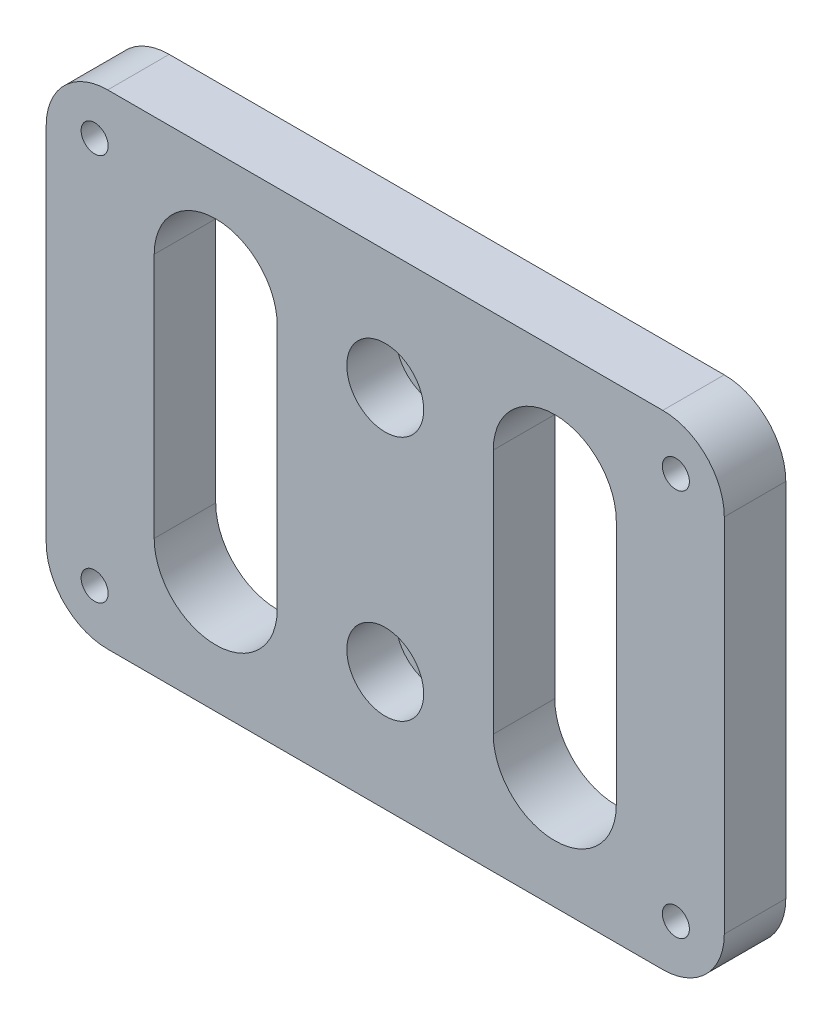
ISO-10303-21;
HEADER;
FILE_DESCRIPTION(('STEP AP214'),'2;1');
FILE_NAME('part.step','',(''),(''),'','','');
FILE_SCHEMA(('AUTOMOTIVE_DESIGN { 1 0 10303 214 1 1 1 1 }'));
ENDSEC;
DATA;
#1=APPLICATION_CONTEXT('core data for automotive mechanical design processes');
#2=APPLICATION_PROTOCOL_DEFINITION('international standard','automotive_design',2000,#1);
#3=PRODUCT_CONTEXT('',#1,'mechanical');
#4=PRODUCT('Part','Part','',(#3));
#5=PRODUCT_RELATED_PRODUCT_CATEGORY('part','',(#4));
#6=PRODUCT_DEFINITION_FORMATION('','',#4);
#7=PRODUCT_DEFINITION_CONTEXT('part definition',#1,'design');
#8=PRODUCT_DEFINITION('design','',#6,#7);
#9=PRODUCT_DEFINITION_SHAPE('','',#8);
#10=(LENGTH_UNIT() NAMED_UNIT(*) SI_UNIT(.MILLI.,.METRE.));
#11=(NAMED_UNIT(*) PLANE_ANGLE_UNIT() SI_UNIT($,.RADIAN.));
#12=(NAMED_UNIT(*) SI_UNIT($,.STERADIAN.) SOLID_ANGLE_UNIT());
#13=UNCERTAINTY_MEASURE_WITH_UNIT(LENGTH_MEASURE(1.E-05),#10,'distance_accuracy_value','');
#14=(GEOMETRIC_REPRESENTATION_CONTEXT(3) GLOBAL_UNCERTAINTY_ASSIGNED_CONTEXT((#13)) GLOBAL_UNIT_ASSIGNED_CONTEXT((#10,
#11,#12)) REPRESENTATION_CONTEXT('',''));
#15=CARTESIAN_POINT('',(0.,0.,0.));
#16=DIRECTION('',(0.,0.,1.));
#17=DIRECTION('',(1.,0.,0.));
#18=AXIS2_PLACEMENT_3D('',#15,#16,#17);
#19=CARTESIAN_POINT('',(0.,12.7,6.35));
#20=DIRECTION('',(0.,0.,-1.));
#21=DIRECTION('',(-1.,0.,0.));
#22=AXIS2_PLACEMENT_3D('',#19,#20,#21);
#23=CYLINDRICAL_SURFACE('',#22,2.4892);
#24=CARTESIAN_POINT('',(0.,12.7,0.));
#25=DIRECTION('',(0.,0.,1.));
#26=DIRECTION('',(1.,0.,0.));
#27=AXIS2_PLACEMENT_3D('',#24,#25,#26);
#28=CIRCLE('',#27,2.4892);
#29=CARTESIAN_POINT('',(2.4892,12.7,0.));
#30=VERTEX_POINT('',#29);
#31=EDGE_CURVE('E226',#30,#30,#28,.T.);
#32=ORIENTED_EDGE('',*,*,#31,.F.);
#33=EDGE_LOOP('',(#32));
#34=FACE_BOUND('',#33,.T.);
#35=CARTESIAN_POINT('',(0.,12.7,1.27));
#36=DIRECTION('',(0.,0.,1.));
#37=DIRECTION('',(1.,0.,0.));
#38=AXIS2_PLACEMENT_3D('',#35,#36,#37);
#39=CIRCLE('',#38,2.4892);
#40=CARTESIAN_POINT('',(2.4892,12.7,1.27));
#41=VERTEX_POINT('',#40);
#42=EDGE_CURVE('E37',#41,#41,#39,.T.);
#43=ORIENTED_EDGE('',*,*,#42,.T.);
#44=EDGE_LOOP('',(#43));
#45=FACE_BOUND('',#44,.T.);
#46=ADVANCED_FACE('F33',(#34,#45),#23,.F.);
#47=CARTESIAN_POINT('',(0.,-12.7,6.35));
#48=DIRECTION('',(0.,0.,-1.));
#49=DIRECTION('',(-1.,0.,0.));
#50=AXIS2_PLACEMENT_3D('',#47,#48,#49);
#51=CYLINDRICAL_SURFACE('',#50,2.4892);
#52=CARTESIAN_POINT('',(0.,-12.7,0.));
#53=DIRECTION('',(0.,0.,1.));
#54=DIRECTION('',(1.,0.,0.));
#55=AXIS2_PLACEMENT_3D('',#52,#53,#54);
#56=CIRCLE('',#55,2.4892);
#57=CARTESIAN_POINT('',(2.4892,-12.7,0.));
#58=VERTEX_POINT('',#57);
#59=EDGE_CURVE('E223',#58,#58,#56,.T.);
#60=ORIENTED_EDGE('',*,*,#59,.F.);
#61=EDGE_LOOP('',(#60));
#62=FACE_BOUND('',#61,.T.);
#63=CARTESIAN_POINT('',(0.,-12.7,1.27));
#64=DIRECTION('',(0.,0.,1.));
#65=DIRECTION('',(1.,0.,0.));
#66=AXIS2_PLACEMENT_3D('',#63,#64,#65);
#67=CIRCLE('',#66,2.4892);
#68=CARTESIAN_POINT('',(2.4892,-12.7,1.27));
#69=VERTEX_POINT('',#68);
#70=EDGE_CURVE('E304',#69,#69,#67,.T.);
#71=ORIENTED_EDGE('',*,*,#70,.T.);
#72=EDGE_LOOP('',(#71));
#73=FACE_BOUND('',#72,.T.);
#74=ADVANCED_FACE('F329',(#62,#73),#51,.F.);
#75=CARTESIAN_POINT('',(0.,0.,6.35));
#76=DIRECTION('',(0.,0.,-1.));
#77=DIRECTION('',(-1.,0.,0.));
#78=AXIS2_PLACEMENT_3D('',#75,#76,#77);
#79=PLANE('',#78);
#80=CARTESIAN_POINT('',(0.,12.7,6.35));
#81=DIRECTION('',(0.,0.,1.));
#82=DIRECTION('',(1.,0.,0.));
#83=AXIS2_PLACEMENT_3D('',#80,#81,#82);
#84=CIRCLE('',#83,3.96875);
#85=CARTESIAN_POINT('',(3.96875,12.7,6.35));
#86=VERTEX_POINT('',#85);
#87=EDGE_CURVE('E311',#86,#86,#84,.T.);
#88=ORIENTED_EDGE('',*,*,#87,.F.);
#89=EDGE_LOOP('',(#88));
#90=FACE_BOUND('',#89,.T.);
#91=CARTESIAN_POINT('',(0.,-12.7,6.35));
#92=DIRECTION('',(0.,0.,1.));
#93=DIRECTION('',(1.,0.,0.));
#94=AXIS2_PLACEMENT_3D('',#91,#92,#93);
#95=CIRCLE('',#94,3.96875);
#96=CARTESIAN_POINT('',(3.96875,-12.7,6.35));
#97=VERTEX_POINT('',#96);
#98=EDGE_CURVE('E320',#97,#97,#95,.T.);
#99=ORIENTED_EDGE('',*,*,#98,.F.);
#100=EDGE_LOOP('',(#99));
#101=FACE_BOUND('',#100,.T.);
#102=CARTESIAN_POINT('',(-17.5,-12.7,6.35));
#103=DIRECTION('',(0.,0.,1.));
#104=DIRECTION('',(1.,0.,0.));
#105=AXIS2_PLACEMENT_3D('',#102,#103,#104);
#106=CIRCLE('',#105,6.35);
#107=CARTESIAN_POINT('',(-23.85,-12.7,6.35));
#108=VERTEX_POINT('',#107);
#109=CARTESIAN_POINT('',(-11.15,-12.7,6.35));
#110=VERTEX_POINT('',#109);
#111=EDGE_CURVE('E193',#108,#110,#106,.T.);
#112=ORIENTED_EDGE('',*,*,#111,.F.);
#113=DIRECTION('',(0.,-1.,0.));
#114=VECTOR('',#113,1.);
#115=CARTESIAN_POINT('',(-23.85,-12.7,6.35));
#116=LINE('',#115,#114);
#117=CARTESIAN_POINT('',(-23.85,12.7,6.35));
#118=VERTEX_POINT('',#117);
#119=EDGE_CURVE('E201',#118,#108,#116,.T.);
#120=ORIENTED_EDGE('',*,*,#119,.F.);
#121=CARTESIAN_POINT('',(-17.5,12.7,6.35));
#122=DIRECTION('',(0.,0.,1.));
#123=DIRECTION('',(1.,0.,0.));
#124=AXIS2_PLACEMENT_3D('',#121,#122,#123);
#125=CIRCLE('',#124,6.35);
#126=CARTESIAN_POINT('',(-11.15,12.7,6.35));
#127=VERTEX_POINT('',#126);
#128=EDGE_CURVE('E198',#127,#118,#125,.T.);
#129=ORIENTED_EDGE('',*,*,#128,.F.);
#130=DIRECTION('',(0.,1.,0.));
#131=VECTOR('',#130,1.);
#132=CARTESIAN_POINT('',(-11.15,-12.7,6.35));
#133=LINE('',#132,#131);
#134=EDGE_CURVE('E195',#110,#127,#133,.T.);
#135=ORIENTED_EDGE('',*,*,#134,.F.);
#136=EDGE_LOOP('',(#112,#120,#129,#135));
#137=FACE_BOUND('',#136,.T.);
#138=DIRECTION('',(-1.,0.,0.));
#139=VECTOR('',#138,1.);
#140=CARTESIAN_POINT('',(-35.,25.,6.35));
#141=LINE('',#140,#139);
#142=CARTESIAN_POINT('',(28.65,25.,6.35));
#143=VERTEX_POINT('',#142);
#144=CARTESIAN_POINT('',(-28.65,25.,6.35));
#145=VERTEX_POINT('',#144);
#146=EDGE_CURVE('E262',#143,#145,#141,.T.);
#147=ORIENTED_EDGE('',*,*,#146,.T.);
#148=CARTESIAN_POINT('',(-28.65,18.65,6.35));
#149=DIRECTION('',(0.,0.,-1.));
#150=DIRECTION('',(-1.,0.,0.));
#151=AXIS2_PLACEMENT_3D('',#148,#149,#150);
#152=CIRCLE('',#151,6.35);
#153=CARTESIAN_POINT('',(-35.,18.65,6.35));
#154=VERTEX_POINT('',#153);
#155=EDGE_CURVE('E297',#145,#154,#152,.F.);
#156=ORIENTED_EDGE('',*,*,#155,.T.);
#157=DIRECTION('',(0.,-1.,0.));
#158=VECTOR('',#157,1.);
#159=CARTESIAN_POINT('',(-35.,-25.,6.35));
#160=LINE('',#159,#158);
#161=CARTESIAN_POINT('',(-35.,-18.65,6.35));
#162=VERTEX_POINT('',#161);
#163=EDGE_CURVE('E254',#154,#162,#160,.T.);
#164=ORIENTED_EDGE('',*,*,#163,.T.);
#165=CARTESIAN_POINT('',(-28.65,-18.65,6.35));
#166=DIRECTION('',(0.,0.,-1.));
#167=DIRECTION('',(-1.,0.,0.));
#168=AXIS2_PLACEMENT_3D('',#165,#166,#167);
#169=CIRCLE('',#168,6.35);
#170=CARTESIAN_POINT('',(-28.65,-25.,6.35));
#171=VERTEX_POINT('',#170);
#172=EDGE_CURVE('E295',#162,#171,#169,.F.);
#173=ORIENTED_EDGE('',*,*,#172,.T.);
#174=DIRECTION('',(1.,0.,0.));
#175=VECTOR('',#174,1.);
#176=CARTESIAN_POINT('',(-35.,-25.,6.35));
#177=LINE('',#176,#175);
#178=CARTESIAN_POINT('',(28.65,-25.,6.35));
#179=VERTEX_POINT('',#178);
#180=EDGE_CURVE('E257',#171,#179,#177,.T.);
#181=ORIENTED_EDGE('',*,*,#180,.T.);
#182=CARTESIAN_POINT('',(28.65,-18.65,6.35));
#183=DIRECTION('',(0.,0.,-1.));
#184=DIRECTION('',(-1.,0.,0.));
#185=AXIS2_PLACEMENT_3D('',#182,#183,#184);
#186=CIRCLE('',#185,6.35);
#187=CARTESIAN_POINT('',(35.,-18.65,6.35));
#188=VERTEX_POINT('',#187);
#189=EDGE_CURVE('E56',#179,#188,#186,.F.);
#190=ORIENTED_EDGE('',*,*,#189,.T.);
#191=DIRECTION('',(0.,1.,0.));
#192=VECTOR('',#191,1.);
#193=CARTESIAN_POINT('',(35.,-25.,6.35));
#194=LINE('',#193,#192);
#195=CARTESIAN_POINT('',(35.,18.65,6.35));
#196=VERTEX_POINT('',#195);
#197=EDGE_CURVE('E260',#188,#196,#194,.T.);
#198=ORIENTED_EDGE('',*,*,#197,.T.);
#199=CARTESIAN_POINT('',(28.65,18.65,6.35));
#200=DIRECTION('',(0.,0.,-1.));
#201=DIRECTION('',(-1.,0.,0.));
#202=AXIS2_PLACEMENT_3D('',#199,#200,#201);
#203=CIRCLE('',#202,6.35);
#204=EDGE_CURVE('E292',#196,#143,#203,.F.);
#205=ORIENTED_EDGE('',*,*,#204,.T.);
#206=EDGE_LOOP('',(#147,#156,#164,#173,#181,#190,#198,#205));
#207=FACE_BOUND('',#206,.T.);
#208=CARTESIAN_POINT('',(30.,20.,6.35));
#209=DIRECTION('',(0.,0.,1.));
#210=DIRECTION('',(1.,0.,0.));
#211=AXIS2_PLACEMENT_3D('',#208,#209,#210);
#212=CIRCLE('',#211,1.39700000000001);
#213=CARTESIAN_POINT('',(31.397,20.,6.35));
#214=VERTEX_POINT('',#213);
#215=EDGE_CURVE('E248',#214,#214,#212,.T.);
#216=ORIENTED_EDGE('',*,*,#215,.F.);
#217=EDGE_LOOP('',(#216));
#218=FACE_BOUND('',#217,.T.);
#219=CARTESIAN_POINT('',(30.,-20.,6.35));
#220=DIRECTION('',(0.,0.,1.));
#221=DIRECTION('',(1.,0.,0.));
#222=AXIS2_PLACEMENT_3D('',#219,#220,#221);
#223=CIRCLE('',#222,1.39700000000001);
#224=CARTESIAN_POINT('',(31.397,-20.,6.35));
#225=VERTEX_POINT('',#224);
#226=EDGE_CURVE('E242',#225,#225,#223,.T.);
#227=ORIENTED_EDGE('',*,*,#226,.F.);
#228=EDGE_LOOP('',(#227));
#229=FACE_BOUND('',#228,.T.);
#230=CARTESIAN_POINT('',(-30.,-20.,6.35));
#231=DIRECTION('',(0.,0.,1.));
#232=DIRECTION('',(1.,0.,0.));
#233=AXIS2_PLACEMENT_3D('',#230,#231,#232);
#234=CIRCLE('',#233,1.397);
#235=CARTESIAN_POINT('',(-28.603,-20.,6.35));
#236=VERTEX_POINT('',#235);
#237=EDGE_CURVE('E236',#236,#236,#234,.T.);
#238=ORIENTED_EDGE('',*,*,#237,.F.);
#239=EDGE_LOOP('',(#238));
#240=FACE_BOUND('',#239,.T.);
#241=CARTESIAN_POINT('',(-30.,20.,6.35));
#242=DIRECTION('',(0.,0.,1.));
#243=DIRECTION('',(1.,0.,0.));
#244=AXIS2_PLACEMENT_3D('',#241,#242,#243);
#245=CIRCLE('',#244,1.397);
#246=CARTESIAN_POINT('',(-28.603,20.,6.35));
#247=VERTEX_POINT('',#246);
#248=EDGE_CURVE('E230',#247,#247,#245,.T.);
#249=ORIENTED_EDGE('',*,*,#248,.F.);
#250=EDGE_LOOP('',(#249));
#251=FACE_BOUND('',#250,.T.);
#252=CARTESIAN_POINT('',(17.5,12.7,6.35));
#253=DIRECTION('',(0.,0.,1.));
#254=DIRECTION('',(1.,0.,0.));
#255=AXIS2_PLACEMENT_3D('',#252,#253,#254);
#256=CIRCLE('',#255,6.35);
#257=CARTESIAN_POINT('',(23.85,12.7,6.35));
#258=VERTEX_POINT('',#257);
#259=CARTESIAN_POINT('',(11.15,12.7,6.35));
#260=VERTEX_POINT('',#259);
#261=EDGE_CURVE('E150',#258,#260,#256,.T.);
#262=ORIENTED_EDGE('',*,*,#261,.F.);
#263=DIRECTION('',(0.,1.,0.));
#264=VECTOR('',#263,1.);
#265=CARTESIAN_POINT('',(23.85,12.7,6.35));
#266=LINE('',#265,#264);
#267=CARTESIAN_POINT('',(23.85,-12.7,6.35));
#268=VERTEX_POINT('',#267);
#269=EDGE_CURVE('E176',#268,#258,#266,.T.);
#270=ORIENTED_EDGE('',*,*,#269,.F.);
#271=CARTESIAN_POINT('',(17.5,-12.7,6.35));
#272=DIRECTION('',(0.,0.,1.));
#273=DIRECTION('',(1.,0.,0.));
#274=AXIS2_PLACEMENT_3D('',#271,#272,#273);
#275=CIRCLE('',#274,6.35);
#276=CARTESIAN_POINT('',(11.15,-12.7,6.35));
#277=VERTEX_POINT('',#276);
#278=EDGE_CURVE('E174',#277,#268,#275,.T.);
#279=ORIENTED_EDGE('',*,*,#278,.F.);
#280=DIRECTION('',(0.,-1.,0.));
#281=VECTOR('',#280,1.);
#282=CARTESIAN_POINT('',(11.15,12.7,6.35));
#283=LINE('',#282,#281);
#284=EDGE_CURVE('E160',#260,#277,#283,.T.);
#285=ORIENTED_EDGE('',*,*,#284,.F.);
#286=EDGE_LOOP('',(#262,#270,#279,#285));
#287=FACE_BOUND('',#286,.T.);
#288=ADVANCED_FACE('F172',(#90,#101,#137,#207,#218,#229,#240,#251,#287),#79,.F.);
#289=CARTESIAN_POINT('',(0.,0.,0.));
#290=DIRECTION('',(0.,0.,-1.));
#291=DIRECTION('',(-1.,0.,0.));
#292=AXIS2_PLACEMENT_3D('',#289,#290,#291);
#293=PLANE('',#292);
#294=ORIENTED_EDGE('',*,*,#31,.T.);
#295=EDGE_LOOP('',(#294));
#296=FACE_BOUND('',#295,.T.);
#297=CARTESIAN_POINT('',(-30.,-20.,0.));
#298=DIRECTION('',(0.,0.,1.));
#299=DIRECTION('',(1.,0.,0.));
#300=AXIS2_PLACEMENT_3D('',#297,#298,#299);
#301=CIRCLE('',#300,1.397);
#302=CARTESIAN_POINT('',(-28.603,-20.,0.));
#303=VERTEX_POINT('',#302);
#304=EDGE_CURVE('E233',#303,#303,#301,.T.);
#305=ORIENTED_EDGE('',*,*,#304,.T.);
#306=EDGE_LOOP('',(#305));
#307=FACE_BOUND('',#306,.T.);
#308=CARTESIAN_POINT('',(30.,20.,0.));
#309=DIRECTION('',(0.,0.,1.));
#310=DIRECTION('',(1.,0.,0.));
#311=AXIS2_PLACEMENT_3D('',#308,#309,#310);
#312=CIRCLE('',#311,1.39700000000001);
#313=CARTESIAN_POINT('',(31.397,20.,0.));
#314=VERTEX_POINT('',#313);
#315=EDGE_CURVE('E245',#314,#314,#312,.T.);
#316=ORIENTED_EDGE('',*,*,#315,.T.);
#317=EDGE_LOOP('',(#316));
#318=FACE_BOUND('',#317,.T.);
#319=DIRECTION('',(0.,-1.,0.));
#320=VECTOR('',#319,1.);
#321=CARTESIAN_POINT('',(-35.,-25.,0.));
#322=LINE('',#321,#320);
#323=CARTESIAN_POINT('',(-35.,18.65,0.));
#324=VERTEX_POINT('',#323);
#325=CARTESIAN_POINT('',(-35.,-18.65,0.));
#326=VERTEX_POINT('',#325);
#327=EDGE_CURVE('E251',#324,#326,#322,.T.);
#328=ORIENTED_EDGE('',*,*,#327,.F.);
#329=CARTESIAN_POINT('',(-28.65,18.65,0.));
#330=DIRECTION('',(0.,0.,-1.));
#331=DIRECTION('',(-1.,0.,0.));
#332=AXIS2_PLACEMENT_3D('',#329,#330,#331);
#333=CIRCLE('',#332,6.35);
#334=CARTESIAN_POINT('',(-28.65,25.,0.));
#335=VERTEX_POINT('',#334);
#336=EDGE_CURVE('E285',#324,#335,#333,.T.);
#337=ORIENTED_EDGE('',*,*,#336,.T.);
#338=DIRECTION('',(-1.,0.,0.));
#339=VECTOR('',#338,1.);
#340=CARTESIAN_POINT('',(-35.,25.,0.));
#341=LINE('',#340,#339);
#342=CARTESIAN_POINT('',(28.65,25.,0.));
#343=VERTEX_POINT('',#342);
#344=EDGE_CURVE('E258',#343,#335,#341,.T.);
#345=ORIENTED_EDGE('',*,*,#344,.F.);
#346=CARTESIAN_POINT('',(28.65,18.65,0.));
#347=DIRECTION('',(0.,0.,-1.));
#348=DIRECTION('',(-1.,0.,0.));
#349=AXIS2_PLACEMENT_3D('',#346,#347,#348);
#350=CIRCLE('',#349,6.35);
#351=CARTESIAN_POINT('',(35.,18.65,0.));
#352=VERTEX_POINT('',#351);
#353=EDGE_CURVE('E279',#343,#352,#350,.T.);
#354=ORIENTED_EDGE('',*,*,#353,.T.);
#355=DIRECTION('',(0.,1.,0.));
#356=VECTOR('',#355,1.);
#357=CARTESIAN_POINT('',(35.,-25.,0.));
#358=LINE('',#357,#356);
#359=CARTESIAN_POINT('',(35.,-18.65,0.));
#360=VERTEX_POINT('',#359);
#361=EDGE_CURVE('E271',#360,#352,#358,.T.);
#362=ORIENTED_EDGE('',*,*,#361,.F.);
#363=CARTESIAN_POINT('',(28.65,-18.65,0.));
#364=DIRECTION('',(0.,0.,-1.));
#365=DIRECTION('',(-1.,0.,0.));
#366=AXIS2_PLACEMENT_3D('',#363,#364,#365);
#367=CIRCLE('',#366,6.35);
#368=CARTESIAN_POINT('',(28.65,-25.,0.));
#369=VERTEX_POINT('',#368);
#370=EDGE_CURVE('E281',#360,#369,#367,.T.);
#371=ORIENTED_EDGE('',*,*,#370,.T.);
#372=DIRECTION('',(1.,0.,0.));
#373=VECTOR('',#372,1.);
#374=CARTESIAN_POINT('',(-35.,-25.,0.));
#375=LINE('',#374,#373);
#376=CARTESIAN_POINT('',(-28.65,-25.,0.));
#377=VERTEX_POINT('',#376);
#378=EDGE_CURVE('E268',#377,#369,#375,.T.);
#379=ORIENTED_EDGE('',*,*,#378,.F.);
#380=CARTESIAN_POINT('',(-28.65,-18.65,0.));
#381=DIRECTION('',(0.,0.,-1.));
#382=DIRECTION('',(-1.,0.,0.));
#383=AXIS2_PLACEMENT_3D('',#380,#381,#382);
#384=CIRCLE('',#383,6.35);
#385=EDGE_CURVE('E283',#377,#326,#384,.T.);
#386=ORIENTED_EDGE('',*,*,#385,.T.);
#387=EDGE_LOOP('',(#328,#337,#345,#354,#362,#371,#379,#386));
#388=FACE_BOUND('',#387,.T.);
#389=CARTESIAN_POINT('',(30.,-20.,0.));
#390=DIRECTION('',(0.,0.,1.));
#391=DIRECTION('',(1.,0.,0.));
#392=AXIS2_PLACEMENT_3D('',#389,#390,#391);
#393=CIRCLE('',#392,1.39700000000001);
#394=CARTESIAN_POINT('',(31.397,-20.,0.));
#395=VERTEX_POINT('',#394);
#396=EDGE_CURVE('E239',#395,#395,#393,.T.);
#397=ORIENTED_EDGE('',*,*,#396,.T.);
#398=EDGE_LOOP('',(#397));
#399=FACE_BOUND('',#398,.T.);
#400=CARTESIAN_POINT('',(-30.,20.,0.));
#401=DIRECTION('',(0.,0.,1.));
#402=DIRECTION('',(1.,0.,0.));
#403=AXIS2_PLACEMENT_3D('',#400,#401,#402);
#404=CIRCLE('',#403,1.397);
#405=CARTESIAN_POINT('',(-28.603,20.,0.));
#406=VERTEX_POINT('',#405);
#407=EDGE_CURVE('E229',#406,#406,#404,.T.);
#408=ORIENTED_EDGE('',*,*,#407,.T.);
#409=EDGE_LOOP('',(#408));
#410=FACE_BOUND('',#409,.T.);
#411=ORIENTED_EDGE('',*,*,#59,.T.);
#412=EDGE_LOOP('',(#411));
#413=FACE_BOUND('',#412,.T.);
#414=DIRECTION('',(0.,-1.,0.));
#415=VECTOR('',#414,1.);
#416=CARTESIAN_POINT('',(-23.85,-12.7,0.));
#417=LINE('',#416,#415);
#418=CARTESIAN_POINT('',(-23.85,12.7,0.));
#419=VERTEX_POINT('',#418);
#420=CARTESIAN_POINT('',(-23.85,-12.7,0.));
#421=VERTEX_POINT('',#420);
#422=EDGE_CURVE('E196',#419,#421,#417,.T.);
#423=ORIENTED_EDGE('',*,*,#422,.T.);
#424=CARTESIAN_POINT('',(-17.5,-12.7,0.));
#425=DIRECTION('',(0.,0.,1.));
#426=DIRECTION('',(1.,0.,0.));
#427=AXIS2_PLACEMENT_3D('',#424,#425,#426);
#428=CIRCLE('',#427,6.35);
#429=CARTESIAN_POINT('',(-11.15,-12.7,0.));
#430=VERTEX_POINT('',#429);
#431=EDGE_CURVE('E168',#421,#430,#428,.T.);
#432=ORIENTED_EDGE('',*,*,#431,.T.);
#433=DIRECTION('',(0.,1.,0.));
#434=VECTOR('',#433,1.);
#435=CARTESIAN_POINT('',(-11.15,-12.7,0.));
#436=LINE('',#435,#434);
#437=CARTESIAN_POINT('',(-11.15,12.7,0.));
#438=VERTEX_POINT('',#437);
#439=EDGE_CURVE('E206',#430,#438,#436,.T.);
#440=ORIENTED_EDGE('',*,*,#439,.T.);
#441=CARTESIAN_POINT('',(-17.5,12.7,0.));
#442=DIRECTION('',(0.,0.,1.));
#443=DIRECTION('',(1.,0.,0.));
#444=AXIS2_PLACEMENT_3D('',#441,#442,#443);
#445=CIRCLE('',#444,6.35);
#446=EDGE_CURVE('E209',#438,#419,#445,.T.);
#447=ORIENTED_EDGE('',*,*,#446,.T.);
#448=EDGE_LOOP('',(#423,#432,#440,#447));
#449=FACE_BOUND('',#448,.T.);
#450=DIRECTION('',(0.,1.,0.));
#451=VECTOR('',#450,1.);
#452=CARTESIAN_POINT('',(23.85,12.7,0.));
#453=LINE('',#452,#451);
#454=CARTESIAN_POINT('',(23.85,-12.7,0.));
#455=VERTEX_POINT('',#454);
#456=CARTESIAN_POINT('',(23.85,12.7,0.));
#457=VERTEX_POINT('',#456);
#458=EDGE_CURVE('E161',#455,#457,#453,.T.);
#459=ORIENTED_EDGE('',*,*,#458,.T.);
#460=CARTESIAN_POINT('',(17.5,12.7,0.));
#461=DIRECTION('',(0.,0.,1.));
#462=DIRECTION('',(1.,0.,0.));
#463=AXIS2_PLACEMENT_3D('',#460,#461,#462);
#464=CIRCLE('',#463,6.35);
#465=CARTESIAN_POINT('',(11.15,12.7,0.));
#466=VERTEX_POINT('',#465);
#467=EDGE_CURVE('E181',#457,#466,#464,.T.);
#468=ORIENTED_EDGE('',*,*,#467,.T.);
#469=DIRECTION('',(0.,-1.,0.));
#470=VECTOR('',#469,1.);
#471=CARTESIAN_POINT('',(11.15,12.7,0.));
#472=LINE('',#471,#470);
#473=CARTESIAN_POINT('',(11.15,-12.7,0.));
#474=VERTEX_POINT('',#473);
#475=EDGE_CURVE('E167',#466,#474,#472,.T.);
#476=ORIENTED_EDGE('',*,*,#475,.T.);
#477=CARTESIAN_POINT('',(17.5,-12.7,0.));
#478=DIRECTION('',(0.,0.,1.));
#479=DIRECTION('',(1.,0.,0.));
#480=AXIS2_PLACEMENT_3D('',#477,#478,#479);
#481=CIRCLE('',#480,6.35);
#482=EDGE_CURVE('E184',#474,#455,#481,.T.);
#483=ORIENTED_EDGE('',*,*,#482,.T.);
#484=EDGE_LOOP('',(#459,#468,#476,#483));
#485=FACE_BOUND('',#484,.T.);
#486=ADVANCED_FACE('F328',(#296,#307,#318,#388,#399,#410,#413,#449,#485),#293,.T.);
#487=CARTESIAN_POINT('',(-35.,-25.,6.35));
#488=DIRECTION('',(1.,0.,0.));
#489=DIRECTION('',(0.,0.,-1.));
#490=AXIS2_PLACEMENT_3D('',#487,#488,#489);
#491=PLANE('',#490);
#492=ORIENTED_EDGE('',*,*,#163,.F.);
#493=DIRECTION('',(0.,0.,-1.));
#494=VECTOR('',#493,1.);
#495=CARTESIAN_POINT('',(-35.,18.65,6.35));
#496=LINE('',#495,#494);
#497=EDGE_CURVE('E276',#154,#324,#496,.T.);
#498=ORIENTED_EDGE('',*,*,#497,.T.);
#499=ORIENTED_EDGE('',*,*,#327,.T.);
#500=DIRECTION('',(0.,0.,-1.));
#501=VECTOR('',#500,1.);
#502=CARTESIAN_POINT('',(-35.,-18.65,6.35));
#503=LINE('',#502,#501);
#504=EDGE_CURVE('E265',#326,#162,#503,.F.);
#505=ORIENTED_EDGE('',*,*,#504,.T.);
#506=EDGE_LOOP('',(#492,#498,#499,#505));
#507=FACE_BOUND('',#506,.T.);
#508=ADVANCED_FACE('F356',(#507),#491,.F.);
#509=CARTESIAN_POINT('',(-35.,-25.,6.35));
#510=DIRECTION('',(0.,1.,0.));
#511=DIRECTION('',(0.,0.,1.));
#512=AXIS2_PLACEMENT_3D('',#509,#510,#511);
#513=PLANE('',#512);
#514=ORIENTED_EDGE('',*,*,#180,.F.);
#515=DIRECTION('',(0.,0.,-1.));
#516=VECTOR('',#515,1.);
#517=CARTESIAN_POINT('',(-28.65,-25.,6.35));
#518=LINE('',#517,#516);
#519=EDGE_CURVE('E301',#171,#377,#518,.T.);
#520=ORIENTED_EDGE('',*,*,#519,.T.);
#521=ORIENTED_EDGE('',*,*,#378,.T.);
#522=DIRECTION('',(0.,0.,-1.));
#523=VECTOR('',#522,1.);
#524=CARTESIAN_POINT('',(28.65,-25.,6.35));
#525=LINE('',#524,#523);
#526=EDGE_CURVE('E299',#369,#179,#525,.F.);
#527=ORIENTED_EDGE('',*,*,#526,.T.);
#528=EDGE_LOOP('',(#514,#520,#521,#527));
#529=FACE_BOUND('',#528,.T.);
#530=ADVANCED_FACE('F408',(#529),#513,.F.);
#531=CARTESIAN_POINT('',(35.,-25.,6.35));
#532=DIRECTION('',(-1.,0.,0.));
#533=DIRECTION('',(0.,0.,1.));
#534=AXIS2_PLACEMENT_3D('',#531,#532,#533);
#535=PLANE('',#534);
#536=ORIENTED_EDGE('',*,*,#197,.F.);
#537=DIRECTION('',(0.,0.,-1.));
#538=VECTOR('',#537,1.);
#539=CARTESIAN_POINT('',(35.,-18.65,6.35));
#540=LINE('',#539,#538);
#541=EDGE_CURVE('E11',#188,#360,#540,.T.);
#542=ORIENTED_EDGE('',*,*,#541,.T.);
#543=ORIENTED_EDGE('',*,*,#361,.T.);
#544=DIRECTION('',(0.,0.,-1.));
#545=VECTOR('',#544,1.);
#546=CARTESIAN_POINT('',(35.,18.65,6.35));
#547=LINE('',#546,#545);
#548=EDGE_CURVE('E42',#352,#196,#547,.F.);
#549=ORIENTED_EDGE('',*,*,#548,.T.);
#550=EDGE_LOOP('',(#536,#542,#543,#549));
#551=FACE_BOUND('',#550,.T.);
#552=ADVANCED_FACE('F404',(#551),#535,.F.);
#553=CARTESIAN_POINT('',(-35.,25.,6.35));
#554=DIRECTION('',(0.,-1.,0.));
#555=DIRECTION('',(0.,0.,-1.));
#556=AXIS2_PLACEMENT_3D('',#553,#554,#555);
#557=PLANE('',#556);
#558=ORIENTED_EDGE('',*,*,#344,.T.);
#559=DIRECTION('',(0.,0.,-1.));
#560=VECTOR('',#559,1.);
#561=CARTESIAN_POINT('',(-28.65,25.,6.35));
#562=LINE('',#561,#560);
#563=EDGE_CURVE('E290',#335,#145,#562,.F.);
#564=ORIENTED_EDGE('',*,*,#563,.T.);
#565=ORIENTED_EDGE('',*,*,#146,.F.);
#566=DIRECTION('',(0.,0.,-1.));
#567=VECTOR('',#566,1.);
#568=CARTESIAN_POINT('',(28.65,25.,6.35));
#569=LINE('',#568,#567);
#570=EDGE_CURVE('E287',#143,#343,#569,.T.);
#571=ORIENTED_EDGE('',*,*,#570,.T.);
#572=EDGE_LOOP('',(#558,#564,#565,#571));
#573=FACE_BOUND('',#572,.T.);
#574=ADVANCED_FACE('F399',(#573),#557,.F.);
#575=CARTESIAN_POINT('',(30.,20.,6.35));
#576=DIRECTION('',(0.,0.,-1.));
#577=DIRECTION('',(-1.,0.,0.));
#578=AXIS2_PLACEMENT_3D('',#575,#576,#577);
#579=CYLINDRICAL_SURFACE('',#578,1.39700000000001);
#580=ORIENTED_EDGE('',*,*,#215,.T.);
#581=EDGE_LOOP('',(#580));
#582=FACE_BOUND('',#581,.T.);
#583=ORIENTED_EDGE('',*,*,#315,.F.);
#584=EDGE_LOOP('',(#583));
#585=FACE_BOUND('',#584,.T.);
#586=ADVANCED_FACE('F396',(#582,#585),#579,.F.);
#587=CARTESIAN_POINT('',(30.,-20.,6.35));
#588=DIRECTION('',(0.,0.,-1.));
#589=DIRECTION('',(-1.,0.,0.));
#590=AXIS2_PLACEMENT_3D('',#587,#588,#589);
#591=CYLINDRICAL_SURFACE('',#590,1.39700000000001);
#592=ORIENTED_EDGE('',*,*,#226,.T.);
#593=EDGE_LOOP('',(#592));
#594=FACE_BOUND('',#593,.T.);
#595=ORIENTED_EDGE('',*,*,#396,.F.);
#596=EDGE_LOOP('',(#595));
#597=FACE_BOUND('',#596,.T.);
#598=ADVANCED_FACE('F392',(#594,#597),#591,.F.);
#599=CARTESIAN_POINT('',(-30.,-20.,6.35));
#600=DIRECTION('',(0.,0.,-1.));
#601=DIRECTION('',(-1.,0.,0.));
#602=AXIS2_PLACEMENT_3D('',#599,#600,#601);
#603=CYLINDRICAL_SURFACE('',#602,1.397);
#604=ORIENTED_EDGE('',*,*,#237,.T.);
#605=EDGE_LOOP('',(#604));
#606=FACE_BOUND('',#605,.T.);
#607=ORIENTED_EDGE('',*,*,#304,.F.);
#608=EDGE_LOOP('',(#607));
#609=FACE_BOUND('',#608,.T.);
#610=ADVANCED_FACE('F350',(#606,#609),#603,.F.);
#611=CARTESIAN_POINT('',(-30.,20.,6.35));
#612=DIRECTION('',(0.,0.,-1.));
#613=DIRECTION('',(-1.,0.,0.));
#614=AXIS2_PLACEMENT_3D('',#611,#612,#613);
#615=CYLINDRICAL_SURFACE('',#614,1.397);
#616=ORIENTED_EDGE('',*,*,#248,.T.);
#617=EDGE_LOOP('',(#616));
#618=FACE_BOUND('',#617,.T.);
#619=ORIENTED_EDGE('',*,*,#407,.F.);
#620=EDGE_LOOP('',(#619));
#621=FACE_BOUND('',#620,.T.);
#622=ADVANCED_FACE('F346',(#618,#621),#615,.F.);
#623=CARTESIAN_POINT('',(-17.5,-12.7,6.35));
#624=DIRECTION('',(0.,0.,-1.));
#625=DIRECTION('',(-1.,0.,0.));
#626=AXIS2_PLACEMENT_3D('',#623,#624,#625);
#627=CYLINDRICAL_SURFACE('',#626,6.35);
#628=ORIENTED_EDGE('',*,*,#431,.F.);
#629=DIRECTION('',(0.,0.,-1.));
#630=VECTOR('',#629,1.);
#631=CARTESIAN_POINT('',(-23.85,-12.7,6.35));
#632=LINE('',#631,#630);
#633=EDGE_CURVE('E203',#108,#421,#632,.T.);
#634=ORIENTED_EDGE('',*,*,#633,.F.);
#635=ORIENTED_EDGE('',*,*,#111,.T.);
#636=DIRECTION('',(0.,0.,-1.));
#637=VECTOR('',#636,1.);
#638=CARTESIAN_POINT('',(-11.15,-12.7,6.35));
#639=LINE('',#638,#637);
#640=EDGE_CURVE('E220',#110,#430,#639,.T.);
#641=ORIENTED_EDGE('',*,*,#640,.T.);
#642=EDGE_LOOP('',(#628,#634,#635,#641));
#643=FACE_BOUND('',#642,.T.);
#644=ADVANCED_FACE('F349',(#643),#627,.F.);
#645=CARTESIAN_POINT('',(-11.15,-12.7,6.35));
#646=DIRECTION('',(-1.,0.,0.));
#647=DIRECTION('',(0.,-1.,0.));
#648=AXIS2_PLACEMENT_3D('',#645,#646,#647);
#649=PLANE('',#648);
#650=ORIENTED_EDGE('',*,*,#439,.F.);
#651=ORIENTED_EDGE('',*,*,#640,.F.);
#652=ORIENTED_EDGE('',*,*,#134,.T.);
#653=DIRECTION('',(0.,0.,-1.));
#654=VECTOR('',#653,1.);
#655=CARTESIAN_POINT('',(-11.15,12.7,6.35));
#656=LINE('',#655,#654);
#657=EDGE_CURVE('E218',#127,#438,#656,.T.);
#658=ORIENTED_EDGE('',*,*,#657,.T.);
#659=EDGE_LOOP('',(#650,#651,#652,#658));
#660=FACE_BOUND('',#659,.T.);
#661=ADVANCED_FACE('F593',(#660),#649,.T.);
#662=CARTESIAN_POINT('',(-17.5,12.7,6.35));
#663=DIRECTION('',(0.,0.,-1.));
#664=DIRECTION('',(-1.,0.,0.));
#665=AXIS2_PLACEMENT_3D('',#662,#663,#664);
#666=CYLINDRICAL_SURFACE('',#665,6.35);
#667=ORIENTED_EDGE('',*,*,#446,.F.);
#668=ORIENTED_EDGE('',*,*,#657,.F.);
#669=ORIENTED_EDGE('',*,*,#128,.T.);
#670=DIRECTION('',(0.,0.,-1.));
#671=VECTOR('',#670,1.);
#672=CARTESIAN_POINT('',(-23.85,12.7,6.35));
#673=LINE('',#672,#671);
#674=EDGE_CURVE('E216',#118,#419,#673,.T.);
#675=ORIENTED_EDGE('',*,*,#674,.T.);
#676=EDGE_LOOP('',(#667,#668,#669,#675));
#677=FACE_BOUND('',#676,.T.);
#678=ADVANCED_FACE('F583',(#677),#666,.F.);
#679=CARTESIAN_POINT('',(-23.85,-12.7,6.35));
#680=DIRECTION('',(1.,0.,0.));
#681=DIRECTION('',(0.,1.,0.));
#682=AXIS2_PLACEMENT_3D('',#679,#680,#681);
#683=PLANE('',#682);
#684=ORIENTED_EDGE('',*,*,#422,.F.);
#685=ORIENTED_EDGE('',*,*,#674,.F.);
#686=ORIENTED_EDGE('',*,*,#119,.T.);
#687=ORIENTED_EDGE('',*,*,#633,.T.);
#688=EDGE_LOOP('',(#684,#685,#686,#687));
#689=FACE_BOUND('',#688,.T.);
#690=ADVANCED_FACE('F574',(#689),#683,.T.);
#691=CARTESIAN_POINT('',(17.5,12.7,6.35));
#692=DIRECTION('',(0.,0.,-1.));
#693=DIRECTION('',(-1.,0.,0.));
#694=AXIS2_PLACEMENT_3D('',#691,#692,#693);
#695=CYLINDRICAL_SURFACE('',#694,6.35);
#696=ORIENTED_EDGE('',*,*,#467,.F.);
#697=DIRECTION('',(0.,0.,-1.));
#698=VECTOR('',#697,1.);
#699=CARTESIAN_POINT('',(23.85,12.7,6.35));
#700=LINE('',#699,#698);
#701=EDGE_CURVE('E156',#258,#457,#700,.T.);
#702=ORIENTED_EDGE('',*,*,#701,.F.);
#703=ORIENTED_EDGE('',*,*,#261,.T.);
#704=DIRECTION('',(0.,0.,-1.));
#705=VECTOR('',#704,1.);
#706=CARTESIAN_POINT('',(11.15,12.7,6.35));
#707=LINE('',#706,#705);
#708=EDGE_CURVE('E153',#260,#466,#707,.T.);
#709=ORIENTED_EDGE('',*,*,#708,.T.);
#710=EDGE_LOOP('',(#696,#702,#703,#709));
#711=FACE_BOUND('',#710,.T.);
#712=ADVANCED_FACE('F152',(#711),#695,.F.);
#713=CARTESIAN_POINT('',(11.15,12.7,6.35));
#714=DIRECTION('',(1.,0.,0.));
#715=DIRECTION('',(0.,0.,-1.));
#716=AXIS2_PLACEMENT_3D('',#713,#714,#715);
#717=PLANE('',#716);
#718=ORIENTED_EDGE('',*,*,#475,.F.);
#719=ORIENTED_EDGE('',*,*,#708,.F.);
#720=ORIENTED_EDGE('',*,*,#284,.T.);
#721=DIRECTION('',(0.,0.,-1.));
#722=VECTOR('',#721,1.);
#723=CARTESIAN_POINT('',(11.15,-12.7,6.35));
#724=LINE('',#723,#722);
#725=EDGE_CURVE('E169',#277,#474,#724,.T.);
#726=ORIENTED_EDGE('',*,*,#725,.T.);
#727=EDGE_LOOP('',(#718,#719,#720,#726));
#728=FACE_BOUND('',#727,.T.);
#729=ADVANCED_FACE('F164',(#728),#717,.T.);
#730=CARTESIAN_POINT('',(17.5,-12.7,6.35));
#731=DIRECTION('',(0.,0.,-1.));
#732=DIRECTION('',(-1.,0.,0.));
#733=AXIS2_PLACEMENT_3D('',#730,#731,#732);
#734=CYLINDRICAL_SURFACE('',#733,6.35);
#735=ORIENTED_EDGE('',*,*,#482,.F.);
#736=ORIENTED_EDGE('',*,*,#725,.F.);
#737=ORIENTED_EDGE('',*,*,#278,.T.);
#738=DIRECTION('',(0.,0.,-1.));
#739=VECTOR('',#738,1.);
#740=CARTESIAN_POINT('',(23.85,-12.7,6.35));
#741=LINE('',#740,#739);
#742=EDGE_CURVE('E190',#268,#455,#741,.T.);
#743=ORIENTED_EDGE('',*,*,#742,.T.);
#744=EDGE_LOOP('',(#735,#736,#737,#743));
#745=FACE_BOUND('',#744,.T.);
#746=ADVANCED_FACE('F368',(#745),#734,.F.);
#747=CARTESIAN_POINT('',(23.85,12.7,6.35));
#748=DIRECTION('',(-1.,0.,0.));
#749=DIRECTION('',(0.,0.,1.));
#750=AXIS2_PLACEMENT_3D('',#747,#748,#749);
#751=PLANE('',#750);
#752=ORIENTED_EDGE('',*,*,#458,.F.);
#753=ORIENTED_EDGE('',*,*,#742,.F.);
#754=ORIENTED_EDGE('',*,*,#269,.T.);
#755=ORIENTED_EDGE('',*,*,#701,.T.);
#756=EDGE_LOOP('',(#752,#753,#754,#755));
#757=FACE_BOUND('',#756,.T.);
#758=ADVANCED_FACE('F366',(#757),#751,.T.);
#759=CARTESIAN_POINT('',(-28.65,18.65,6.35));
#760=DIRECTION('',(0.,0.,-1.));
#761=DIRECTION('',(-1.,0.,0.));
#762=AXIS2_PLACEMENT_3D('',#759,#760,#761);
#763=CYLINDRICAL_SURFACE('',#762,6.35);
#764=ORIENTED_EDGE('',*,*,#155,.F.);
#765=ORIENTED_EDGE('',*,*,#563,.F.);
#766=ORIENTED_EDGE('',*,*,#336,.F.);
#767=ORIENTED_EDGE('',*,*,#497,.F.);
#768=EDGE_LOOP('',(#764,#765,#766,#767));
#769=FACE_BOUND('',#768,.T.);
#770=ADVANCED_FACE('F375',(#769),#763,.T.);
#771=CARTESIAN_POINT('',(-28.65,-18.65,6.35));
#772=DIRECTION('',(0.,0.,-1.));
#773=DIRECTION('',(-1.,0.,0.));
#774=AXIS2_PLACEMENT_3D('',#771,#772,#773);
#775=CYLINDRICAL_SURFACE('',#774,6.35);
#776=ORIENTED_EDGE('',*,*,#172,.F.);
#777=ORIENTED_EDGE('',*,*,#504,.F.);
#778=ORIENTED_EDGE('',*,*,#385,.F.);
#779=ORIENTED_EDGE('',*,*,#519,.F.);
#780=EDGE_LOOP('',(#776,#777,#778,#779));
#781=FACE_BOUND('',#780,.T.);
#782=ADVANCED_FACE('F417',(#781),#775,.T.);
#783=CARTESIAN_POINT('',(28.65,-18.65,6.35));
#784=DIRECTION('',(0.,0.,-1.));
#785=DIRECTION('',(-1.,0.,0.));
#786=AXIS2_PLACEMENT_3D('',#783,#784,#785);
#787=CYLINDRICAL_SURFACE('',#786,6.35);
#788=ORIENTED_EDGE('',*,*,#189,.F.);
#789=ORIENTED_EDGE('',*,*,#526,.F.);
#790=ORIENTED_EDGE('',*,*,#370,.F.);
#791=ORIENTED_EDGE('',*,*,#541,.F.);
#792=EDGE_LOOP('',(#788,#789,#790,#791));
#793=FACE_BOUND('',#792,.T.);
#794=ADVANCED_FACE('F420',(#793),#787,.T.);
#795=CARTESIAN_POINT('',(28.65,18.65,6.35));
#796=DIRECTION('',(0.,0.,-1.));
#797=DIRECTION('',(-1.,0.,0.));
#798=AXIS2_PLACEMENT_3D('',#795,#796,#797);
#799=CYLINDRICAL_SURFACE('',#798,6.35);
#800=ORIENTED_EDGE('',*,*,#204,.F.);
#801=ORIENTED_EDGE('',*,*,#548,.F.);
#802=ORIENTED_EDGE('',*,*,#353,.F.);
#803=ORIENTED_EDGE('',*,*,#570,.F.);
#804=EDGE_LOOP('',(#800,#801,#802,#803));
#805=FACE_BOUND('',#804,.T.);
#806=ADVANCED_FACE('F35',(#805),#799,.T.);
#807=CARTESIAN_POINT('',(0.,-12.7,1.27));
#808=DIRECTION('',(0.,0.,1.));
#809=DIRECTION('',(1.,0.,0.));
#810=AXIS2_PLACEMENT_3D('',#807,#808,#809);
#811=CYLINDRICAL_SURFACE('',#810,3.96875);
#812=CARTESIAN_POINT('',(0.,-12.7,1.27));
#813=DIRECTION('',(0.,0.,1.));
#814=DIRECTION('',(1.,0.,0.));
#815=AXIS2_PLACEMENT_3D('',#812,#813,#814);
#816=CIRCLE('',#815,3.96875);
#817=CARTESIAN_POINT('',(3.96875,-12.7,1.27));
#818=VERTEX_POINT('',#817);
#819=EDGE_CURVE('E316',#818,#818,#816,.T.);
#820=ORIENTED_EDGE('',*,*,#819,.F.);
#821=EDGE_LOOP('',(#820));
#822=FACE_BOUND('',#821,.T.);
#823=ORIENTED_EDGE('',*,*,#98,.T.);
#824=EDGE_LOOP('',(#823));
#825=FACE_BOUND('',#824,.T.);
#826=ADVANCED_FACE('F324',(#822,#825),#811,.F.);
#827=CARTESIAN_POINT('',(0.,-12.7,1.27));
#828=DIRECTION('',(0.,0.,1.));
#829=DIRECTION('',(1.,0.,0.));
#830=AXIS2_PLACEMENT_3D('',#827,#828,#829);
#831=PLANE('',#830);
#832=ORIENTED_EDGE('',*,*,#70,.F.);
#833=EDGE_LOOP('',(#832));
#834=FACE_BOUND('',#833,.T.);
#835=ORIENTED_EDGE('',*,*,#819,.T.);
#836=EDGE_LOOP('',(#835));
#837=FACE_BOUND('',#836,.T.);
#838=ADVANCED_FACE('F450',(#834,#837),#831,.T.);
#839=CARTESIAN_POINT('',(0.,12.7,1.27));
#840=DIRECTION('',(0.,0.,1.));
#841=DIRECTION('',(1.,0.,0.));
#842=AXIS2_PLACEMENT_3D('',#839,#840,#841);
#843=CYLINDRICAL_SURFACE('',#842,3.96875);
#844=CARTESIAN_POINT('',(0.,12.7,1.27));
#845=DIRECTION('',(0.,0.,1.));
#846=DIRECTION('',(1.,0.,0.));
#847=AXIS2_PLACEMENT_3D('',#844,#845,#846);
#848=CIRCLE('',#847,3.96875);
#849=CARTESIAN_POINT('',(3.96875,12.7,1.27));
#850=VERTEX_POINT('',#849);
#851=EDGE_CURVE('E306',#850,#850,#848,.T.);
#852=ORIENTED_EDGE('',*,*,#851,.F.);
#853=EDGE_LOOP('',(#852));
#854=FACE_BOUND('',#853,.T.);
#855=ORIENTED_EDGE('',*,*,#87,.T.);
#856=EDGE_LOOP('',(#855));
#857=FACE_BOUND('',#856,.T.);
#858=ADVANCED_FACE('F456',(#854,#857),#843,.F.);
#859=CARTESIAN_POINT('',(0.,12.7,1.27));
#860=DIRECTION('',(0.,0.,1.));
#861=DIRECTION('',(1.,0.,0.));
#862=AXIS2_PLACEMENT_3D('',#859,#860,#861);
#863=PLANE('',#862);
#864=ORIENTED_EDGE('',*,*,#42,.F.);
#865=EDGE_LOOP('',(#864));
#866=FACE_BOUND('',#865,.T.);
#867=ORIENTED_EDGE('',*,*,#851,.T.);
#868=EDGE_LOOP('',(#867));
#869=FACE_BOUND('',#868,.T.);
#870=ADVANCED_FACE('F463',(#866,#869),#863,.T.);
#871=CLOSED_SHELL('',(#46,#74,#288,#486,#508,#530,#552,#574,#586,#598,#610,#622,#644,#661,#678,
#690,#712,#729,#746,#758,#770,#782,#794,#806,#826,#838,#858,#870));
#872=MANIFOLD_SOLID_BREP('B2',#871);
#873=ADVANCED_BREP_SHAPE_REPRESENTATION('',(#18,#872),#14);
#874=SHAPE_DEFINITION_REPRESENTATION(#9,#873);
ENDSEC;
END-ISO-10303-21;
